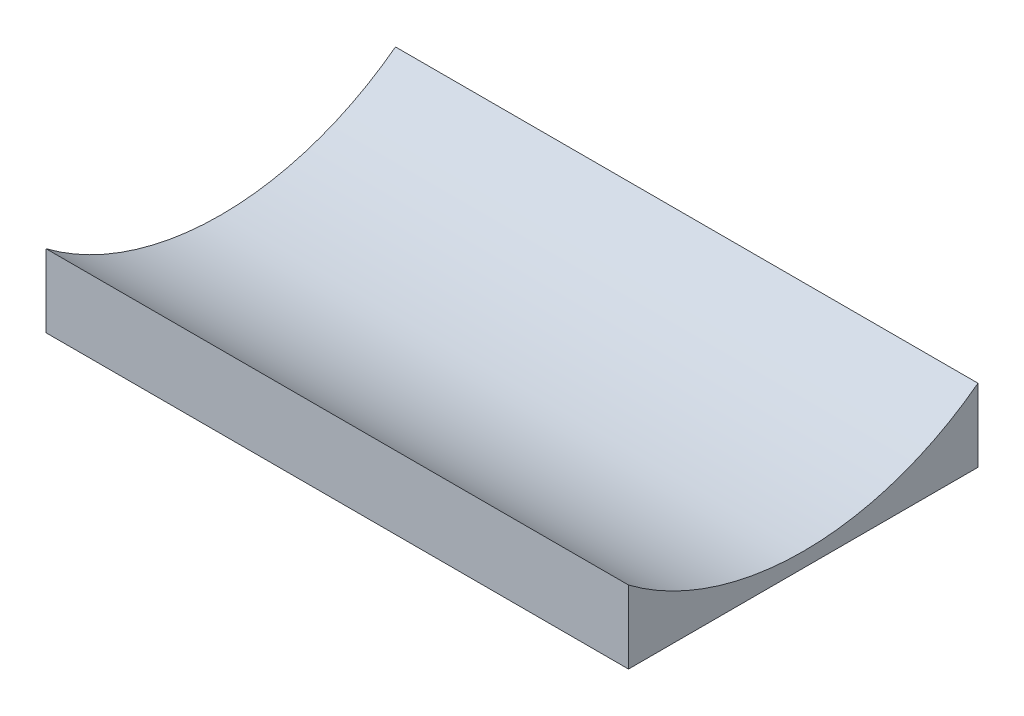
ISO-10303-21;
HEADER;
FILE_DESCRIPTION(('STEP AP214'),'2;1');
FILE_NAME('part.step','',(''),(''),'','','');
FILE_SCHEMA(('AUTOMOTIVE_DESIGN { 1 0 10303 214 1 1 1 1 }'));
ENDSEC;
DATA;
#1=APPLICATION_CONTEXT('core data for automotive mechanical design processes');
#2=APPLICATION_PROTOCOL_DEFINITION('international standard','automotive_design',2000,#1);
#3=PRODUCT_CONTEXT('',#1,'mechanical');
#4=PRODUCT('Part','Part','',(#3));
#5=PRODUCT_RELATED_PRODUCT_CATEGORY('part','',(#4));
#6=PRODUCT_DEFINITION_FORMATION('','',#4);
#7=PRODUCT_DEFINITION_CONTEXT('part definition',#1,'design');
#8=PRODUCT_DEFINITION('design','',#6,#7);
#9=PRODUCT_DEFINITION_SHAPE('','',#8);
#10=(LENGTH_UNIT() NAMED_UNIT(*) SI_UNIT(.MILLI.,.METRE.));
#11=(NAMED_UNIT(*) PLANE_ANGLE_UNIT() SI_UNIT($,.RADIAN.));
#12=(NAMED_UNIT(*) SI_UNIT($,.STERADIAN.) SOLID_ANGLE_UNIT());
#13=UNCERTAINTY_MEASURE_WITH_UNIT(LENGTH_MEASURE(1.E-05),#10,'distance_accuracy_value','');
#14=(GEOMETRIC_REPRESENTATION_CONTEXT(3) GLOBAL_UNCERTAINTY_ASSIGNED_CONTEXT((#13)) GLOBAL_UNIT_ASSIGNED_CONTEXT((#10,
#11,#12)) REPRESENTATION_CONTEXT('',''));
#15=CARTESIAN_POINT('',(0.,0.,0.));
#16=DIRECTION('',(0.,0.,1.));
#17=DIRECTION('',(1.,0.,0.));
#18=AXIS2_PLACEMENT_3D('',#15,#16,#17);
#19=CARTESIAN_POINT('',(-50.,10.,-30.));
#20=DIRECTION('',(1.,0.,0.));
#21=DIRECTION('',(0.,0.,-1.));
#22=AXIS2_PLACEMENT_3D('',#19,#20,#21);
#23=PLANE('',#22);
#24=DIRECTION('',(0.,1.,0.));
#25=VECTOR('',#24,1.);
#26=CARTESIAN_POINT('',(-50.,0.,-29.9978836503213));
#27=LINE('',#26,#25);
#28=CARTESIAN_POINT('',(-50.,-2.5,-29.9978836503213));
#29=VERTEX_POINT('',#28);
#30=CARTESIAN_POINT('',(-50.,0.,-29.9978836503213));
#31=VERTEX_POINT('',#30);
#32=EDGE_CURVE('E85',#29,#31,#27,.T.);
#33=ORIENTED_EDGE('',*,*,#32,.F.);
#34=DIRECTION('',(0.,0.,-1.));
#35=VECTOR('',#34,1.);
#36=CARTESIAN_POINT('',(-50.,-2.5,30.0021163496787));
#37=LINE('',#36,#35);
#38=CARTESIAN_POINT('',(-50.,-2.5,30.));
#39=VERTEX_POINT('',#38);
#40=EDGE_CURVE('E56',#39,#29,#37,.T.);
#41=ORIENTED_EDGE('',*,*,#40,.F.);
#42=DIRECTION('',(0.,-1.,0.));
#43=VECTOR('',#42,1.);
#44=CARTESIAN_POINT('',(-50.,0.,30.));
#45=LINE('',#44,#43);
#46=CARTESIAN_POINT('',(-49.9999999999999,10.,30.));
#47=VERTEX_POINT('',#46);
#48=EDGE_CURVE('E121',#47,#39,#45,.T.);
#49=ORIENTED_EDGE('',*,*,#48,.F.);
#50=CARTESIAN_POINT('',(-50.,50.0000000000002,0.));
#51=DIRECTION('',(-1.,0.,0.));
#52=DIRECTION('',(0.,0.,1.));
#53=AXIS2_PLACEMENT_3D('',#50,#51,#52);
#54=CIRCLE('',#53,50.0000000000002);
#55=CARTESIAN_POINT('',(-50.,10.,-30.));
#56=VERTEX_POINT('',#55);
#57=EDGE_CURVE('E48',#56,#47,#54,.T.);
#58=ORIENTED_EDGE('',*,*,#57,.F.);
#59=DIRECTION('',(0.,-1.,0.));
#60=VECTOR('',#59,1.);
#61=CARTESIAN_POINT('',(-50.,10.,-30.));
#62=LINE('',#61,#60);
#63=CARTESIAN_POINT('',(-50.,0.,-30.));
#64=VERTEX_POINT('',#63);
#65=EDGE_CURVE('E133',#56,#64,#62,.T.);
#66=ORIENTED_EDGE('',*,*,#65,.T.);
#67=DIRECTION('',(0.,0.,1.));
#68=VECTOR('',#67,1.);
#69=CARTESIAN_POINT('',(-50.,0.,-30.));
#70=LINE('',#69,#68);
#71=EDGE_CURVE('E139',#64,#31,#70,.T.);
#72=ORIENTED_EDGE('',*,*,#71,.T.);
#73=EDGE_LOOP('',(#33,#41,#49,#58,#66,#72));
#74=FACE_BOUND('',#73,.T.);
#75=ADVANCED_FACE('F38',(#74),#23,.F.);
#76=CARTESIAN_POINT('',(50.,10.,-30.));
#77=DIRECTION('',(-1.,0.,0.));
#78=DIRECTION('',(0.,0.,1.));
#79=AXIS2_PLACEMENT_3D('',#76,#77,#78);
#80=PLANE('',#79);
#81=DIRECTION('',(0.,-1.,0.));
#82=VECTOR('',#81,1.);
#83=CARTESIAN_POINT('',(50.,0.,30.));
#84=LINE('',#83,#82);
#85=CARTESIAN_POINT('',(50.0000000000001,10.,30.));
#86=VERTEX_POINT('',#85);
#87=CARTESIAN_POINT('',(50.,-2.5,30.));
#88=VERTEX_POINT('',#87);
#89=EDGE_CURVE('E113',#86,#88,#84,.T.);
#90=ORIENTED_EDGE('',*,*,#89,.T.);
#91=DIRECTION('',(0.,0.,-1.));
#92=VECTOR('',#91,1.);
#93=CARTESIAN_POINT('',(50.,-2.5,30.0021163496787));
#94=LINE('',#93,#92);
#95=CARTESIAN_POINT('',(50.,-2.5,-29.9978836503213));
#96=VERTEX_POINT('',#95);
#97=EDGE_CURVE('E103',#88,#96,#94,.T.);
#98=ORIENTED_EDGE('',*,*,#97,.T.);
#99=DIRECTION('',(0.,1.,0.));
#100=VECTOR('',#99,1.);
#101=CARTESIAN_POINT('',(50.,0.,-29.9978836503213));
#102=LINE('',#101,#100);
#103=CARTESIAN_POINT('',(50.,0.,-29.9978836503213));
#104=VERTEX_POINT('',#103);
#105=EDGE_CURVE('E111',#96,#104,#102,.T.);
#106=ORIENTED_EDGE('',*,*,#105,.T.);
#107=DIRECTION('',(0.,0.,-1.));
#108=VECTOR('',#107,1.);
#109=CARTESIAN_POINT('',(50.,0.,-30.));
#110=LINE('',#109,#108);
#111=CARTESIAN_POINT('',(50.,0.,-30.));
#112=VERTEX_POINT('',#111);
#113=EDGE_CURVE('E141',#104,#112,#110,.T.);
#114=ORIENTED_EDGE('',*,*,#113,.T.);
#115=DIRECTION('',(0.,-1.,0.));
#116=VECTOR('',#115,1.);
#117=CARTESIAN_POINT('',(50.,10.,-30.));
#118=LINE('',#117,#116);
#119=CARTESIAN_POINT('',(50.,10.,-30.));
#120=VERTEX_POINT('',#119);
#121=EDGE_CURVE('E134',#120,#112,#118,.T.);
#122=ORIENTED_EDGE('',*,*,#121,.F.);
#123=CARTESIAN_POINT('',(50.,50.0000000000002,0.));
#124=DIRECTION('',(-1.,0.,0.));
#125=DIRECTION('',(0.,0.,1.));
#126=AXIS2_PLACEMENT_3D('',#123,#124,#125);
#127=CIRCLE('',#126,50.0000000000002);
#128=EDGE_CURVE('E42',#120,#86,#127,.T.);
#129=ORIENTED_EDGE('',*,*,#128,.T.);
#130=EDGE_LOOP('',(#90,#98,#106,#114,#122,#129));
#131=FACE_BOUND('',#130,.T.);
#132=ADVANCED_FACE('F110',(#131),#80,.F.);
#133=CARTESIAN_POINT('',(50.,10.,-30.));
#134=DIRECTION('',(0.,0.,1.));
#135=DIRECTION('',(1.,0.,0.));
#136=AXIS2_PLACEMENT_3D('',#133,#134,#135);
#137=PLANE('',#136);
#138=DIRECTION('',(-1.,0.,0.));
#139=VECTOR('',#138,1.);
#140=CARTESIAN_POINT('',(50.,0.,-30.));
#141=LINE('',#140,#139);
#142=EDGE_CURVE('E65',#112,#64,#141,.T.);
#143=ORIENTED_EDGE('',*,*,#142,.T.);
#144=ORIENTED_EDGE('',*,*,#65,.F.);
#145=DIRECTION('',(-1.,0.,0.));
#146=VECTOR('',#145,1.);
#147=CARTESIAN_POINT('',(50.,10.,-30.));
#148=LINE('',#147,#146);
#149=EDGE_CURVE('E11',#120,#56,#148,.T.);
#150=ORIENTED_EDGE('',*,*,#149,.F.);
#151=ORIENTED_EDGE('',*,*,#121,.T.);
#152=EDGE_LOOP('',(#143,#144,#150,#151));
#153=FACE_BOUND('',#152,.T.);
#154=ADVANCED_FACE('F162',(#153),#137,.F.);
#155=CARTESIAN_POINT('',(0.,0.,0.));
#156=DIRECTION('',(0.,-1.,0.));
#157=DIRECTION('',(0.,0.,-1.));
#158=AXIS2_PLACEMENT_3D('',#155,#156,#157);
#159=PLANE('',#158);
#160=DIRECTION('',(1.,0.,0.));
#161=VECTOR('',#160,1.);
#162=CARTESIAN_POINT('',(-50.,0.,-29.9978836503213));
#163=LINE('',#162,#161);
#164=EDGE_CURVE('E118',#31,#104,#163,.T.);
#165=ORIENTED_EDGE('',*,*,#164,.F.);
#166=ORIENTED_EDGE('',*,*,#71,.F.);
#167=ORIENTED_EDGE('',*,*,#142,.F.);
#168=ORIENTED_EDGE('',*,*,#113,.F.);
#169=EDGE_LOOP('',(#165,#166,#167,#168));
#170=FACE_BOUND('',#169,.T.);
#171=ADVANCED_FACE('F165',(#170),#159,.T.);
#172=CARTESIAN_POINT('',(321.308748883995,50.0000000000002,0.));
#173=DIRECTION('',(-1.,0.,0.));
#174=DIRECTION('',(0.,0.,1.));
#175=AXIS2_PLACEMENT_3D('',#172,#173,#174);
#176=CYLINDRICAL_SURFACE('',#175,50.0000000000002);
#177=ORIENTED_EDGE('',*,*,#57,.T.);
#178=DIRECTION('',(1.,0.,0.));
#179=VECTOR('',#178,1.);
#180=CARTESIAN_POINT('',(50.,10.,30.));
#181=LINE('',#180,#179);
#182=EDGE_CURVE('E127',#47,#86,#181,.T.);
#183=ORIENTED_EDGE('',*,*,#182,.T.);
#184=ORIENTED_EDGE('',*,*,#128,.F.);
#185=ORIENTED_EDGE('',*,*,#149,.T.);
#186=EDGE_LOOP('',(#177,#183,#184,#185));
#187=FACE_BOUND('',#186,.T.);
#188=ADVANCED_FACE('F40',(#187),#176,.F.);
#189=CARTESIAN_POINT('',(-50.,0.,30.));
#190=DIRECTION('',(0.,0.,1.));
#191=DIRECTION('',(1.,0.,0.));
#192=AXIS2_PLACEMENT_3D('',#189,#190,#191);
#193=PLANE('',#192);
#194=DIRECTION('',(-1.,0.,0.));
#195=VECTOR('',#194,1.);
#196=CARTESIAN_POINT('',(-50.,-2.5,30.));
#197=LINE('',#196,#195);
#198=EDGE_CURVE('E115',#88,#39,#197,.T.);
#199=ORIENTED_EDGE('',*,*,#198,.F.);
#200=ORIENTED_EDGE('',*,*,#89,.F.);
#201=ORIENTED_EDGE('',*,*,#182,.F.);
#202=ORIENTED_EDGE('',*,*,#48,.T.);
#203=EDGE_LOOP('',(#199,#200,#201,#202));
#204=FACE_BOUND('',#203,.T.);
#205=ADVANCED_FACE('F154',(#204),#193,.T.);
#206=CARTESIAN_POINT('',(-50.,0.,-29.9978836503213));
#207=DIRECTION('',(0.,0.,-1.));
#208=DIRECTION('',(-1.,0.,0.));
#209=AXIS2_PLACEMENT_3D('',#206,#207,#208);
#210=PLANE('',#209);
#211=DIRECTION('',(1.,0.,0.));
#212=VECTOR('',#211,1.);
#213=CARTESIAN_POINT('',(50.,-2.5,-29.9978836503213));
#214=LINE('',#213,#212);
#215=EDGE_CURVE('E100',#29,#96,#214,.T.);
#216=ORIENTED_EDGE('',*,*,#215,.F.);
#217=ORIENTED_EDGE('',*,*,#32,.T.);
#218=ORIENTED_EDGE('',*,*,#164,.T.);
#219=ORIENTED_EDGE('',*,*,#105,.F.);
#220=EDGE_LOOP('',(#216,#217,#218,#219));
#221=FACE_BOUND('',#220,.T.);
#222=ADVANCED_FACE('F117',(#221),#210,.T.);
#223=CARTESIAN_POINT('',(50.,-2.5,30.0021163496787));
#224=DIRECTION('',(0.,1.,0.));
#225=DIRECTION('',(0.,0.,1.));
#226=AXIS2_PLACEMENT_3D('',#223,#224,#225);
#227=PLANE('',#226);
#228=ORIENTED_EDGE('',*,*,#198,.T.);
#229=ORIENTED_EDGE('',*,*,#40,.T.);
#230=ORIENTED_EDGE('',*,*,#215,.T.);
#231=ORIENTED_EDGE('',*,*,#97,.F.);
#232=EDGE_LOOP('',(#228,#229,#230,#231));
#233=FACE_BOUND('',#232,.T.);
#234=ADVANCED_FACE('F102',(#233),#227,.F.);
#235=CLOSED_SHELL('',(#75,#132,#154,#171,#188,#205,#222,#234));
#236=MANIFOLD_SOLID_BREP('B2',#235);
#237=ADVANCED_BREP_SHAPE_REPRESENTATION('',(#18,#236),#14);
#238=SHAPE_DEFINITION_REPRESENTATION(#9,#237);
ENDSEC;
END-ISO-10303-21;
